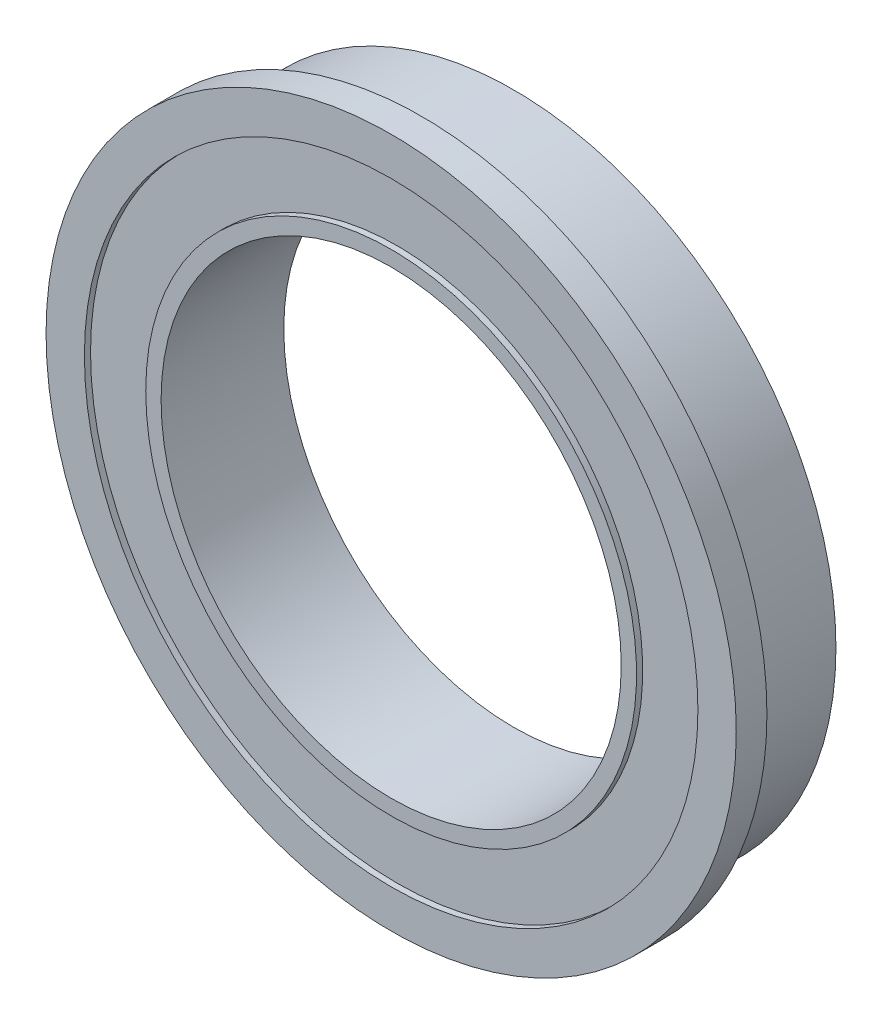
ISO-10303-21;
HEADER;
FILE_DESCRIPTION(('STEP AP214'),'2;1');
FILE_NAME('part.step','',(''),(''),'','','');
FILE_SCHEMA(('AUTOMOTIVE_DESIGN { 1 0 10303 214 1 1 1 1 }'));
ENDSEC;
DATA;
#1=APPLICATION_CONTEXT('core data for automotive mechanical design processes');
#2=APPLICATION_PROTOCOL_DEFINITION('international standard','automotive_design',2000,#1);
#3=PRODUCT_CONTEXT('',#1,'mechanical');
#4=PRODUCT('Part','Part','',(#3));
#5=PRODUCT_RELATED_PRODUCT_CATEGORY('part','',(#4));
#6=PRODUCT_DEFINITION_FORMATION('','',#4);
#7=PRODUCT_DEFINITION_CONTEXT('part definition',#1,'design');
#8=PRODUCT_DEFINITION('design','',#6,#7);
#9=PRODUCT_DEFINITION_SHAPE('','',#8);
#10=(LENGTH_UNIT() NAMED_UNIT(*) SI_UNIT(.MILLI.,.METRE.));
#11=(NAMED_UNIT(*) PLANE_ANGLE_UNIT() SI_UNIT($,.RADIAN.));
#12=(NAMED_UNIT(*) SI_UNIT($,.STERADIAN.) SOLID_ANGLE_UNIT());
#13=UNCERTAINTY_MEASURE_WITH_UNIT(LENGTH_MEASURE(1.E-05),#10,'distance_accuracy_value','');
#14=(GEOMETRIC_REPRESENTATION_CONTEXT(3) GLOBAL_UNCERTAINTY_ASSIGNED_CONTEXT((#13)) GLOBAL_UNIT_ASSIGNED_CONTEXT((#10,
#11,#12)) REPRESENTATION_CONTEXT('',''));
#15=CARTESIAN_POINT('',(0.,0.,0.));
#16=DIRECTION('',(0.,0.,1.));
#17=DIRECTION('',(1.,0.,0.));
#18=AXIS2_PLACEMENT_3D('',#15,#16,#17);
#19=CARTESIAN_POINT('',(0.,0.,1.));
#20=DIRECTION('',(0.,0.,1.));
#21=DIRECTION('',(1.,0.,0.));
#22=AXIS2_PLACEMENT_3D('',#19,#20,#21);
#23=PLANE('',#22);
#24=CARTESIAN_POINT('',(0.,0.,1.));
#25=DIRECTION('',(0.,0.,1.));
#26=DIRECTION('',(1.,0.,0.));
#27=AXIS2_PLACEMENT_3D('',#24,#25,#26);
#28=CIRCLE('',#27,7.5);
#29=CARTESIAN_POINT('',(7.5,0.,1.));
#30=VERTEX_POINT('',#29);
#31=EDGE_CURVE('E53',#30,#30,#28,.T.);
#32=ORIENTED_EDGE('',*,*,#31,.F.);
#33=EDGE_LOOP('',(#32));
#34=FACE_BOUND('',#33,.T.);
#35=CARTESIAN_POINT('',(0.,0.,1.));
#36=DIRECTION('',(0.,0.,-1.));
#37=DIRECTION('',(-1.,0.,0.));
#38=AXIS2_PLACEMENT_3D('',#35,#36,#37);
#39=CIRCLE('',#38,8.);
#40=CARTESIAN_POINT('',(-8.,0.,1.));
#41=VERTEX_POINT('',#40);
#42=EDGE_CURVE('E77',#41,#41,#39,.T.);
#43=ORIENTED_EDGE('',*,*,#42,.F.);
#44=EDGE_LOOP('',(#43));
#45=FACE_BOUND('',#44,.T.);
#46=ADVANCED_FACE('F34',(#34,#45),#23,.T.);
#47=CARTESIAN_POINT('',(0.,0.,-3.));
#48=DIRECTION('',(0.,0.,1.));
#49=DIRECTION('',(1.,0.,0.));
#50=AXIS2_PLACEMENT_3D('',#47,#48,#49);
#51=PLANE('',#50);
#52=CARTESIAN_POINT('',(0.,0.,-3.));
#53=DIRECTION('',(0.,0.,1.));
#54=DIRECTION('',(1.,0.,0.));
#55=AXIS2_PLACEMENT_3D('',#52,#53,#54);
#56=CIRCLE('',#55,7.5);
#57=CARTESIAN_POINT('',(7.5,0.,-3.));
#58=VERTEX_POINT('',#57);
#59=EDGE_CURVE('E52',#58,#58,#56,.T.);
#60=ORIENTED_EDGE('',*,*,#59,.T.);
#61=EDGE_LOOP('',(#60));
#62=FACE_BOUND('',#61,.T.);
#63=CARTESIAN_POINT('',(0.,0.,-3.));
#64=DIRECTION('',(0.,0.,-1.));
#65=DIRECTION('',(-1.,0.,0.));
#66=AXIS2_PLACEMENT_3D('',#63,#64,#65);
#67=CIRCLE('',#66,8.);
#68=CARTESIAN_POINT('',(-8.,0.,-3.));
#69=VERTEX_POINT('',#68);
#70=EDGE_CURVE('E65',#69,#69,#67,.T.);
#71=ORIENTED_EDGE('',*,*,#70,.T.);
#72=EDGE_LOOP('',(#71));
#73=FACE_BOUND('',#72,.T.);
#74=ADVANCED_FACE('F93',(#62,#73),#51,.F.);
#75=CARTESIAN_POINT('',(0.,0.,1.));
#76=DIRECTION('',(0.,0.,-1.));
#77=DIRECTION('',(-1.,0.,0.));
#78=AXIS2_PLACEMENT_3D('',#75,#76,#77);
#79=CIRCLE('',#78,10.);
#80=CARTESIAN_POINT('',(-10.,0.,1.));
#81=VERTEX_POINT('',#80);
#82=EDGE_CURVE('E71',#81,#81,#79,.T.);
#83=ORIENTED_EDGE('',*,*,#82,.T.);
#84=EDGE_LOOP('',(#83));
#85=FACE_BOUND('',#84,.T.);
#86=CARTESIAN_POINT('',(0.,0.,1.));
#87=DIRECTION('',(0.,0.,1.));
#88=DIRECTION('',(1.,0.,0.));
#89=AXIS2_PLACEMENT_3D('',#86,#87,#88);
#90=CIRCLE('',#89,11.25);
#91=CARTESIAN_POINT('',(11.25,0.,1.));
#92=VERTEX_POINT('',#91);
#93=EDGE_CURVE('E10',#92,#92,#90,.T.);
#94=ORIENTED_EDGE('',*,*,#93,.T.);
#95=EDGE_LOOP('',(#94));
#96=FACE_BOUND('',#95,.T.);
#97=ADVANCED_FACE('F96',(#85,#96),#23,.T.);
#98=CARTESIAN_POINT('',(0.,0.,0.));
#99=DIRECTION('',(0.,0.,1.));
#100=DIRECTION('',(1.,0.,0.));
#101=AXIS2_PLACEMENT_3D('',#98,#99,#100);
#102=PLANE('',#101);
#103=CARTESIAN_POINT('',(0.,0.,0.));
#104=DIRECTION('',(0.,0.,1.));
#105=DIRECTION('',(1.,0.,0.));
#106=AXIS2_PLACEMENT_3D('',#103,#104,#105);
#107=CIRCLE('',#106,11.25);
#108=CARTESIAN_POINT('',(11.25,0.,0.));
#109=VERTEX_POINT('',#108);
#110=EDGE_CURVE('E38',#109,#109,#107,.T.);
#111=ORIENTED_EDGE('',*,*,#110,.F.);
#112=EDGE_LOOP('',(#111));
#113=FACE_BOUND('',#112,.T.);
#114=CARTESIAN_POINT('',(0.,0.,0.));
#115=DIRECTION('',(0.,0.,1.));
#116=DIRECTION('',(1.,0.,0.));
#117=AXIS2_PLACEMENT_3D('',#114,#115,#116);
#118=CIRCLE('',#117,10.5);
#119=CARTESIAN_POINT('',(10.5,0.,0.));
#120=VERTEX_POINT('',#119);
#121=EDGE_CURVE('E45',#120,#120,#118,.T.);
#122=ORIENTED_EDGE('',*,*,#121,.T.);
#123=EDGE_LOOP('',(#122));
#124=FACE_BOUND('',#123,.T.);
#125=ADVANCED_FACE('F106',(#113,#124),#102,.F.);
#126=CARTESIAN_POINT('',(0.,0.,1.));
#127=DIRECTION('',(0.,0.,-1.));
#128=DIRECTION('',(-1.,0.,0.));
#129=AXIS2_PLACEMENT_3D('',#126,#127,#128);
#130=CYLINDRICAL_SURFACE('',#129,11.25);
#131=ORIENTED_EDGE('',*,*,#93,.F.);
#132=EDGE_LOOP('',(#131));
#133=FACE_BOUND('',#132,.T.);
#134=ORIENTED_EDGE('',*,*,#110,.T.);
#135=EDGE_LOOP('',(#134));
#136=FACE_BOUND('',#135,.T.);
#137=ADVANCED_FACE('F36',(#133,#136),#130,.T.);
#138=CARTESIAN_POINT('',(0.,0.,-3.));
#139=DIRECTION('',(0.,0.,1.));
#140=DIRECTION('',(1.,0.,0.));
#141=AXIS2_PLACEMENT_3D('',#138,#139,#140);
#142=CYLINDRICAL_SURFACE('',#141,10.5);
#143=CARTESIAN_POINT('',(0.,0.,-3.));
#144=DIRECTION('',(0.,0.,1.));
#145=DIRECTION('',(1.,0.,0.));
#146=AXIS2_PLACEMENT_3D('',#143,#144,#145);
#147=CIRCLE('',#146,10.5);
#148=CARTESIAN_POINT('',(10.5,0.,-3.));
#149=VERTEX_POINT('',#148);
#150=EDGE_CURVE('E49',#149,#149,#147,.T.);
#151=ORIENTED_EDGE('',*,*,#150,.T.);
#152=EDGE_LOOP('',(#151));
#153=FACE_BOUND('',#152,.T.);
#154=ORIENTED_EDGE('',*,*,#121,.F.);
#155=EDGE_LOOP('',(#154));
#156=FACE_BOUND('',#155,.T.);
#157=ADVANCED_FACE('F139',(#153,#156),#142,.T.);
#158=CARTESIAN_POINT('',(0.,0.,-3.));
#159=DIRECTION('',(0.,0.,-1.));
#160=DIRECTION('',(-1.,0.,0.));
#161=AXIS2_PLACEMENT_3D('',#158,#159,#160);
#162=CIRCLE('',#161,10.);
#163=CARTESIAN_POINT('',(-10.,0.,-3.));
#164=VERTEX_POINT('',#163);
#165=EDGE_CURVE('E59',#164,#164,#162,.T.);
#166=ORIENTED_EDGE('',*,*,#165,.F.);
#167=EDGE_LOOP('',(#166));
#168=FACE_BOUND('',#167,.T.);
#169=ORIENTED_EDGE('',*,*,#150,.F.);
#170=EDGE_LOOP('',(#169));
#171=FACE_BOUND('',#170,.T.);
#172=ADVANCED_FACE('F102',(#168,#171),#51,.F.);
#173=CARTESIAN_POINT('',(0.,0.,-3.));
#174=DIRECTION('',(0.,0.,1.));
#175=DIRECTION('',(1.,0.,0.));
#176=AXIS2_PLACEMENT_3D('',#173,#174,#175);
#177=CYLINDRICAL_SURFACE('',#176,7.5);
#178=ORIENTED_EDGE('',*,*,#59,.F.);
#179=EDGE_LOOP('',(#178));
#180=FACE_BOUND('',#179,.T.);
#181=ORIENTED_EDGE('',*,*,#31,.T.);
#182=EDGE_LOOP('',(#181));
#183=FACE_BOUND('',#182,.T.);
#184=ADVANCED_FACE('F134',(#180,#183),#177,.F.);
#185=CARTESIAN_POINT('',(0.,0.,-2.8));
#186=DIRECTION('',(0.,0.,-1.));
#187=DIRECTION('',(-1.,0.,0.));
#188=AXIS2_PLACEMENT_3D('',#185,#186,#187);
#189=CYLINDRICAL_SURFACE('',#188,10.);
#190=CARTESIAN_POINT('',(0.,0.,-2.8));
#191=DIRECTION('',(0.,0.,-1.));
#192=DIRECTION('',(-1.,0.,0.));
#193=AXIS2_PLACEMENT_3D('',#190,#191,#192);
#194=CIRCLE('',#193,10.);
#195=CARTESIAN_POINT('',(-10.,0.,-2.8));
#196=VERTEX_POINT('',#195);
#197=EDGE_CURVE('E56',#196,#196,#194,.T.);
#198=ORIENTED_EDGE('',*,*,#197,.F.);
#199=EDGE_LOOP('',(#198));
#200=FACE_BOUND('',#199,.T.);
#201=ORIENTED_EDGE('',*,*,#165,.T.);
#202=EDGE_LOOP('',(#201));
#203=FACE_BOUND('',#202,.T.);
#204=ADVANCED_FACE('F130',(#200,#203),#189,.F.);
#205=CARTESIAN_POINT('',(0.,0.,-2.8));
#206=DIRECTION('',(0.,0.,-1.));
#207=DIRECTION('',(-1.,0.,0.));
#208=AXIS2_PLACEMENT_3D('',#205,#206,#207);
#209=PLANE('',#208);
#210=CARTESIAN_POINT('',(0.,0.,-2.8));
#211=DIRECTION('',(0.,0.,-1.));
#212=DIRECTION('',(-1.,0.,0.));
#213=AXIS2_PLACEMENT_3D('',#210,#211,#212);
#214=CIRCLE('',#213,8.);
#215=CARTESIAN_POINT('',(-8.,0.,-2.8));
#216=VERTEX_POINT('',#215);
#217=EDGE_CURVE('E62',#216,#216,#214,.T.);
#218=ORIENTED_EDGE('',*,*,#217,.F.);
#219=EDGE_LOOP('',(#218));
#220=FACE_BOUND('',#219,.T.);
#221=ORIENTED_EDGE('',*,*,#197,.T.);
#222=EDGE_LOOP('',(#221));
#223=FACE_BOUND('',#222,.T.);
#224=ADVANCED_FACE('F126',(#220,#223),#209,.T.);
#225=CARTESIAN_POINT('',(0.,0.,-2.8));
#226=DIRECTION('',(0.,0.,-1.));
#227=DIRECTION('',(-1.,0.,0.));
#228=AXIS2_PLACEMENT_3D('',#225,#226,#227);
#229=CYLINDRICAL_SURFACE('',#228,8.);
#230=ORIENTED_EDGE('',*,*,#217,.T.);
#231=EDGE_LOOP('',(#230));
#232=FACE_BOUND('',#231,.T.);
#233=ORIENTED_EDGE('',*,*,#70,.F.);
#234=EDGE_LOOP('',(#233));
#235=FACE_BOUND('',#234,.T.);
#236=ADVANCED_FACE('F120',(#232,#235),#229,.T.);
#237=CARTESIAN_POINT('',(0.,0.,0.8));
#238=DIRECTION('',(0.,0.,1.));
#239=DIRECTION('',(-1.,0.,0.));
#240=AXIS2_PLACEMENT_3D('',#237,#238,#239);
#241=PLANE('',#240);
#242=CARTESIAN_POINT('',(0.,0.,0.8));
#243=DIRECTION('',(0.,0.,-1.));
#244=DIRECTION('',(-1.,0.,0.));
#245=AXIS2_PLACEMENT_3D('',#242,#243,#244);
#246=CIRCLE('',#245,10.);
#247=CARTESIAN_POINT('',(-10.,0.,0.8));
#248=VERTEX_POINT('',#247);
#249=EDGE_CURVE('E68',#248,#248,#246,.T.);
#250=ORIENTED_EDGE('',*,*,#249,.F.);
#251=EDGE_LOOP('',(#250));
#252=FACE_BOUND('',#251,.T.);
#253=CARTESIAN_POINT('',(0.,0.,0.8));
#254=DIRECTION('',(0.,0.,-1.));
#255=DIRECTION('',(-1.,0.,0.));
#256=AXIS2_PLACEMENT_3D('',#253,#254,#255);
#257=CIRCLE('',#256,8.);
#258=CARTESIAN_POINT('',(-8.,0.,0.8));
#259=VERTEX_POINT('',#258);
#260=EDGE_CURVE('E74',#259,#259,#257,.T.);
#261=ORIENTED_EDGE('',*,*,#260,.T.);
#262=EDGE_LOOP('',(#261));
#263=FACE_BOUND('',#262,.T.);
#264=ADVANCED_FACE('F83',(#252,#263),#241,.T.);
#265=CARTESIAN_POINT('',(0.,0.,0.8));
#266=DIRECTION('',(0.,0.,1.));
#267=DIRECTION('',(1.,0.,0.));
#268=AXIS2_PLACEMENT_3D('',#265,#266,#267);
#269=CYLINDRICAL_SURFACE('',#268,10.);
#270=ORIENTED_EDGE('',*,*,#249,.T.);
#271=EDGE_LOOP('',(#270));
#272=FACE_BOUND('',#271,.T.);
#273=ORIENTED_EDGE('',*,*,#82,.F.);
#274=EDGE_LOOP('',(#273));
#275=FACE_BOUND('',#274,.T.);
#276=ADVANCED_FACE('F88',(#272,#275),#269,.F.);
#277=CARTESIAN_POINT('',(0.,0.,0.8));
#278=DIRECTION('',(0.,0.,1.));
#279=DIRECTION('',(1.,0.,0.));
#280=AXIS2_PLACEMENT_3D('',#277,#278,#279);
#281=CYLINDRICAL_SURFACE('',#280,8.);
#282=ORIENTED_EDGE('',*,*,#260,.F.);
#283=EDGE_LOOP('',(#282));
#284=FACE_BOUND('',#283,.T.);
#285=ORIENTED_EDGE('',*,*,#42,.T.);
#286=EDGE_LOOP('',(#285));
#287=FACE_BOUND('',#286,.T.);
#288=ADVANCED_FACE('F85',(#284,#287),#281,.T.);
#289=CLOSED_SHELL('',(#46,#74,#97,#125,#137,#157,#172,#184,#204,#224,#236,#264,#276,#288));
#290=MANIFOLD_SOLID_BREP('B2',#289);
#291=ADVANCED_BREP_SHAPE_REPRESENTATION('',(#18,#290),#14);
#292=SHAPE_DEFINITION_REPRESENTATION(#9,#291);
ENDSEC;
END-ISO-10303-21;
